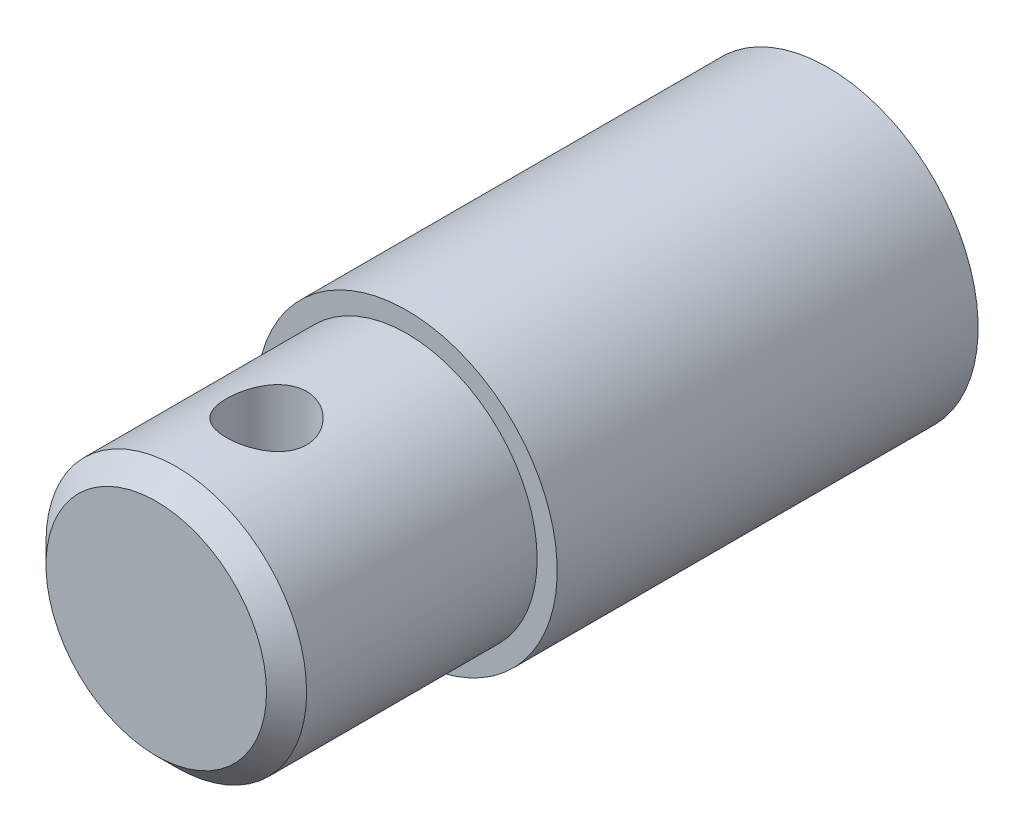
ISO-10303-21;
HEADER;
FILE_DESCRIPTION(('STEP AP214'),'2;1');
FILE_NAME('part.step','',(''),(''),'','','');
FILE_SCHEMA(('AUTOMOTIVE_DESIGN { 1 0 10303 214 1 1 1 1 }'));
ENDSEC;
DATA;
#1=APPLICATION_CONTEXT('core data for automotive mechanical design processes');
#2=APPLICATION_PROTOCOL_DEFINITION('international standard','automotive_design',2000,#1);
#3=PRODUCT_CONTEXT('',#1,'mechanical');
#4=PRODUCT('Part','Part','',(#3));
#5=PRODUCT_RELATED_PRODUCT_CATEGORY('part','',(#4));
#6=PRODUCT_DEFINITION_FORMATION('','',#4);
#7=PRODUCT_DEFINITION_CONTEXT('part definition',#1,'design');
#8=PRODUCT_DEFINITION('design','',#6,#7);
#9=PRODUCT_DEFINITION_SHAPE('','',#8);
#10=(LENGTH_UNIT() NAMED_UNIT(*) SI_UNIT(.MILLI.,.METRE.));
#11=(NAMED_UNIT(*) PLANE_ANGLE_UNIT() SI_UNIT($,.RADIAN.));
#12=(NAMED_UNIT(*) SI_UNIT($,.STERADIAN.) SOLID_ANGLE_UNIT());
#13=UNCERTAINTY_MEASURE_WITH_UNIT(LENGTH_MEASURE(1.E-05),#10,'distance_accuracy_value','');
#14=(GEOMETRIC_REPRESENTATION_CONTEXT(3) GLOBAL_UNCERTAINTY_ASSIGNED_CONTEXT((#13)) GLOBAL_UNIT_ASSIGNED_CONTEXT((#10,
#11,#12)) REPRESENTATION_CONTEXT('',''));
#15=CARTESIAN_POINT('',(0.,0.,0.));
#16=DIRECTION('',(0.,0.,1.));
#17=DIRECTION('',(1.,0.,0.));
#18=AXIS2_PLACEMENT_3D('',#15,#16,#17);
#19=CARTESIAN_POINT('',(0.,0.,42.));
#20=DIRECTION('',(0.,0.,1.));
#21=DIRECTION('',(1.,0.,0.));
#22=AXIS2_PLACEMENT_3D('',#19,#20,#21);
#23=PLANE('',#22);
#24=CARTESIAN_POINT('',(0.,0.,42.));
#25=DIRECTION('',(0.,0.,1.));
#26=DIRECTION('',(1.,0.,0.));
#27=AXIS2_PLACEMENT_3D('',#24,#25,#26);
#28=CIRCLE('',#27,15.);
#29=CARTESIAN_POINT('',(-15.,0.,42.));
#30=VERTEX_POINT('',#29);
#31=EDGE_CURVE('E67',#30,#30,#28,.T.);
#32=ORIENTED_EDGE('',*,*,#31,.T.);
#33=EDGE_LOOP('',(#32));
#34=FACE_BOUND('',#33,.T.);
#35=CARTESIAN_POINT('',(0.,0.,42.));
#36=DIRECTION('',(0.,0.,1.));
#37=DIRECTION('',(1.,0.,0.));
#38=AXIS2_PLACEMENT_3D('',#35,#36,#37);
#39=CIRCLE('',#38,13.);
#40=CARTESIAN_POINT('',(13.,0.,42.));
#41=VERTEX_POINT('',#40);
#42=EDGE_CURVE('E112',#41,#41,#39,.T.);
#43=ORIENTED_EDGE('',*,*,#42,.F.);
#44=EDGE_LOOP('',(#43));
#45=FACE_BOUND('',#44,.T.);
#46=ADVANCED_FACE('F49',(#34,#45),#23,.T.);
#47=CARTESIAN_POINT('',(0.,0.,42.));
#48=DIRECTION('',(0.,0.,-1.));
#49=DIRECTION('',(-1.,0.,0.));
#50=AXIS2_PLACEMENT_3D('',#47,#48,#49);
#51=CYLINDRICAL_SURFACE('',#50,15.);
#52=CARTESIAN_POINT('',(0.,0.,0.));
#53=DIRECTION('',(0.,0.,1.));
#54=DIRECTION('',(1.,0.,0.));
#55=AXIS2_PLACEMENT_3D('',#52,#53,#54);
#56=CIRCLE('',#55,15.);
#57=CARTESIAN_POINT('',(-15.,0.,0.));
#58=VERTEX_POINT('',#57);
#59=EDGE_CURVE('E110',#58,#58,#56,.T.);
#60=CARTESIAN_POINT('',(-15.,0.,42.));
#61=CARTESIAN_POINT('',(-15.,0.,41.5625));
#62=CARTESIAN_POINT('',(-15.,0.,41.125));
#63=CARTESIAN_POINT('',(-15.,0.,40.25));
#64=CARTESIAN_POINT('',(-15.,0.,39.8125));
#65=CARTESIAN_POINT('',(-15.,0.,38.9375));
#66=CARTESIAN_POINT('',(-15.,0.,38.5));
#67=CARTESIAN_POINT('',(-15.,0.,37.625));
#68=CARTESIAN_POINT('',(-15.,0.,37.1875));
#69=CARTESIAN_POINT('',(-15.,0.,36.3125));
#70=CARTESIAN_POINT('',(-15.,0.,35.875));
#71=CARTESIAN_POINT('',(-15.,0.,35.));
#72=CARTESIAN_POINT('',(-15.,0.,34.5625));
#73=CARTESIAN_POINT('',(-15.,0.,33.6875));
#74=CARTESIAN_POINT('',(-15.,0.,33.25));
#75=CARTESIAN_POINT('',(-15.,0.,32.375));
#76=CARTESIAN_POINT('',(-15.,0.,31.9375));
#77=CARTESIAN_POINT('',(-15.,0.,31.0625));
#78=CARTESIAN_POINT('',(-15.,0.,30.625));
#79=CARTESIAN_POINT('',(-15.,0.,29.75));
#80=CARTESIAN_POINT('',(-15.,0.,29.3125));
#81=CARTESIAN_POINT('',(-15.,0.,28.4375));
#82=CARTESIAN_POINT('',(-15.,0.,28.));
#83=CARTESIAN_POINT('',(-15.,0.,27.125));
#84=CARTESIAN_POINT('',(-15.,0.,26.6875));
#85=CARTESIAN_POINT('',(-15.,0.,25.8125));
#86=CARTESIAN_POINT('',(-15.,0.,25.375));
#87=CARTESIAN_POINT('',(-15.,0.,24.5));
#88=CARTESIAN_POINT('',(-15.,0.,24.0625));
#89=CARTESIAN_POINT('',(-15.,0.,23.1875));
#90=CARTESIAN_POINT('',(-15.,0.,22.75));
#91=CARTESIAN_POINT('',(-15.,0.,21.875));
#92=CARTESIAN_POINT('',(-15.,0.,21.4375));
#93=CARTESIAN_POINT('',(-15.,0.,20.5625));
#94=CARTESIAN_POINT('',(-15.,0.,20.125));
#95=CARTESIAN_POINT('',(-15.,0.,19.25));
#96=CARTESIAN_POINT('',(-15.,0.,18.8125));
#97=CARTESIAN_POINT('',(-15.,0.,17.9375));
#98=CARTESIAN_POINT('',(-15.,0.,17.5));
#99=CARTESIAN_POINT('',(-15.,0.,16.625));
#100=CARTESIAN_POINT('',(-15.,0.,16.1875));
#101=CARTESIAN_POINT('',(-15.,0.,15.3125));
#102=CARTESIAN_POINT('',(-15.,0.,14.875));
#103=CARTESIAN_POINT('',(-15.,0.,14.));
#104=CARTESIAN_POINT('',(-15.,0.,13.5625));
#105=CARTESIAN_POINT('',(-15.,0.,12.6875));
#106=CARTESIAN_POINT('',(-15.,0.,12.25));
#107=CARTESIAN_POINT('',(-15.,0.,11.375));
#108=CARTESIAN_POINT('',(-15.,0.,10.9375));
#109=CARTESIAN_POINT('',(-15.,0.,10.0625));
#110=CARTESIAN_POINT('',(-15.,0.,9.625));
#111=CARTESIAN_POINT('',(-15.,0.,8.75));
#112=CARTESIAN_POINT('',(-15.,0.,8.3125));
#113=CARTESIAN_POINT('',(-15.,0.,7.4375));
#114=CARTESIAN_POINT('',(-15.,0.,7.));
#115=CARTESIAN_POINT('',(-15.,0.,6.125));
#116=CARTESIAN_POINT('',(-15.,0.,5.6875));
#117=CARTESIAN_POINT('',(-15.,0.,4.8125));
#118=CARTESIAN_POINT('',(-15.,0.,4.375));
#119=CARTESIAN_POINT('',(-15.,0.,3.5));
#120=CARTESIAN_POINT('',(-15.,0.,3.0625));
#121=CARTESIAN_POINT('',(-15.,0.,2.1875));
#122=CARTESIAN_POINT('',(-15.,0.,1.75));
#123=CARTESIAN_POINT('',(-15.,0.,0.875000000000001));
#124=CARTESIAN_POINT('',(-15.,0.,0.4375));
#125=CARTESIAN_POINT('',(-15.,0.,0.));
#126=B_SPLINE_CURVE_WITH_KNOTS('',3,(#60,#61,#62,#63,#64,#65,#66,#67,#68,#69,#70,#71,#72,#73,
#74,#75,#76,#77,#78,#79,#80,#81,#82,#83,#84,#85,#86,#87,#88,#89,#90,#91,#92,#93,#94,#95,#96,#97,
#98,#99,#100,#101,#102,#103,#104,#105,#106,#107,#108,#109,#110,#111,#112,#113,#114,#115,#116,
#117,#118,#119,#120,#121,#122,#123,#124,#125),.UNSPECIFIED.,.F.,.F.,(4,2,2,2,2,2,2,2,2,2,2,2,2,
2,2,2,2,2,2,2,2,2,2,2,2,2,2,2,2,2,2,2,4),(0.,1.31249999999999,2.625,3.9375,5.25,6.5625,
7.87499999999999,9.18749999999999,10.5,11.8125,13.125,14.4375,15.75,17.0625,18.375,19.6875,21.,
22.3125,23.625,24.9375,26.25,27.5625,28.875,30.1875,31.5,32.8125,34.125,35.4375,36.75,38.0625,
39.375,40.6875,42.),.UNSPECIFIED.);
#127=EDGE_CURVE('BSEAM95',#30,#58,#126,.T.);
#128=ORIENTED_EDGE('',*,*,#31,.F.);
#129=ORIENTED_EDGE('',*,*,#59,.T.);
#130=ORIENTED_EDGE('',*,*,#127,.T.);
#131=ORIENTED_EDGE('',*,*,#127,.F.);
#132=EDGE_LOOP('',(#128,#130,#129,#131));
#133=FACE_BOUND('',#132,.T.);
#134=ADVANCED_FACE('F95',(#133),#51,.T.);
#135=CARTESIAN_POINT('',(0.,0.,0.));
#136=DIRECTION('',(0.,0.,1.));
#137=DIRECTION('',(1.,0.,0.));
#138=AXIS2_PLACEMENT_3D('',#135,#136,#137);
#139=PLANE('',#138);
#140=ORIENTED_EDGE('',*,*,#59,.F.);
#141=EDGE_LOOP('',(#140));
#142=FACE_BOUND('',#141,.T.);
#143=ADVANCED_FACE('F93',(#142),#139,.F.);
#144=CARTESIAN_POINT('',(0.,0.,67.));
#145=DIRECTION('',(0.,0.,-1.));
#146=DIRECTION('',(-1.,0.,0.));
#147=AXIS2_PLACEMENT_3D('',#144,#145,#146);
#148=CYLINDRICAL_SURFACE('',#147,13.);
#149=CARTESIAN_POINT('',(0.,-13.,60.));
#150=CARTESIAN_POINT('',(0.21917294310816,-12.9999985837487,59.9999980781581));
#151=CARTESIAN_POINT('',(0.43836552269895,-12.9944047158586,59.9819267047935));
#152=CARTESIAN_POINT('',(0.870351057968746,-12.9726371053014,59.9103011761296));
#153=CARTESIAN_POINT('',(1.08314237260056,-12.9564606734307,59.856738001735));
#154=CARTESIAN_POINT('',(1.4960330939694,-12.9152971697535,59.7160985862144));
#155=CARTESIAN_POINT('',(1.69615125418069,-12.8903234932247,59.6290732784464));
#156=CARTESIAN_POINT('',(2.07895491073435,-12.8341507183588,59.4241935852655));
#157=CARTESIAN_POINT('',(2.26163781838711,-12.8029506976878,59.3063346315324));
#158=CARTESIAN_POINT('',(2.60987398495358,-12.7365950481322,59.0394046491201));
#159=CARTESIAN_POINT('',(2.77482977131675,-12.7013552117493,58.8895751615137));
#160=CARTESIAN_POINT('',(3.07771416539747,-12.6313850563073,58.5645727529841));
#161=CARTESIAN_POINT('',(3.21563793325195,-12.5966548295175,58.3893953034562));
#162=CARTESIAN_POINT('',(3.46374552369846,-12.5307375569115,58.0135427911452));
#163=CARTESIAN_POINT('',(3.57318962723976,-12.4996547208754,57.8123594214041));
#164=CARTESIAN_POINT('',(3.75644488363178,-12.4458149677457,57.3933320725259));
#165=CARTESIAN_POINT('',(3.83026509829399,-12.4230559336455,57.1754923466926));
#166=CARTESIAN_POINT('',(3.9380032102631,-12.3893201800033,56.7360653878938));
#167=CARTESIAN_POINT('',(3.97302679111731,-12.3780178006712,56.5147749327805));
#168=CARTESIAN_POINT('',(4.00563111791087,-12.3675074101,56.0691925188601));
#169=CARTESIAN_POINT('',(4.00322147146571,-12.3682962955151,55.8449013449835));
#170=CARTESIAN_POINT('',(3.96189396455673,-12.3815913869604,55.4087698587764));
#171=CARTESIAN_POINT('',(3.92437369402148,-12.3936490135325,55.1967811492745));
#172=CARTESIAN_POINT('',(3.81615290498389,-12.4273954440124,54.7822666067291));
#173=CARTESIAN_POINT('',(3.74544895828906,-12.4490852430036,54.5797417537704));
#174=CARTESIAN_POINT('',(3.57186443402681,-12.5000014147365,54.1865399043348));
#175=CARTESIAN_POINT('',(3.46853941654593,-12.5293308435506,53.9960730287498));
#176=CARTESIAN_POINT('',(3.23295451696218,-12.5921734714446,53.6347189112499));
#177=CARTESIAN_POINT('',(3.10068731271405,-12.62568772833,53.4638366407863));
#178=CARTESIAN_POINT('',(2.80408228262993,-12.6949310396933,53.1385912233378));
#179=CARTESIAN_POINT('',(2.63858832591729,-12.7306926222691,52.9852874348672));
#180=CARTESIAN_POINT('',(2.28379541764923,-12.7990966106587,52.7083555913132));
#181=CARTESIAN_POINT('',(2.09449480981525,-12.8317387991714,52.5847296027189));
#182=CARTESIAN_POINT('',(1.69546584739518,-12.8905511373571,52.3699740457451));
#183=CARTESIAN_POINT('',(1.48559743793384,-12.9166718999808,52.2790902719224));
#184=CARTESIAN_POINT('',(1.05256186981955,-12.959142046389,52.1342274920829));
#185=CARTESIAN_POINT('',(0.829398642031535,-12.9754943028036,52.0802376359787));
#186=CARTESIAN_POINT('',(0.385105664864496,-12.996125801437,52.0124839068498));
#187=CARTESIAN_POINT('',(0.164214373456254,-13.0008354422861,51.9972852948686));
#188=CARTESIAN_POINT('',(-0.276982356015462,-12.9989200063321,52.003509532976));
#189=CARTESIAN_POINT('',(-0.497287872376593,-12.9922965294463,52.0249272138741));
#190=CARTESIAN_POINT('',(-0.925571602902956,-12.9687414969643,52.1026209642205));
#191=CARTESIAN_POINT('',(-1.13371871756011,-12.9520607954816,52.1580492943323));
#192=CARTESIAN_POINT('',(-1.53770562273872,-12.9103345307273,52.3011621528542));
#193=CARTESIAN_POINT('',(-1.73354390450734,-12.8852879443756,52.3888506265522));
#194=CARTESIAN_POINT('',(-2.11255922889336,-12.8286676582193,52.5963423896199));
#195=CARTESIAN_POINT('',(-2.29532163039124,-12.7969522254664,52.7168633535303));
#196=CARTESIAN_POINT('',(-2.63851213664825,-12.7306266724605,52.9857336601617));
#197=CARTESIAN_POINT('',(-2.79893434148183,-12.6960157913837,53.1340903299521));
#198=CARTESIAN_POINT('',(-3.09927056018192,-12.6261329181932,53.4611665988979));
#199=CARTESIAN_POINT('',(-3.23816262016191,-12.5908864468145,53.6408321518986));
#200=CARTESIAN_POINT('',(-3.48390975546085,-12.5251192663438,54.0216866692037));
#201=CARTESIAN_POINT('',(-3.59076547791575,-12.4945984617991,54.2228751986315));
#202=CARTESIAN_POINT('',(-3.76871415530627,-12.4420825365784,54.6405565138581));
#203=CARTESIAN_POINT('',(-3.83995734204779,-12.4200516926804,54.8569805395461));
#204=CARTESIAN_POINT('',(-3.9447505224365,-12.3871715179266,55.2995652314521));
#205=CARTESIAN_POINT('',(-3.97831429744217,-12.376318099014,55.525722306332));
#206=CARTESIAN_POINT('',(-4.00582647580866,-12.3674386474697,55.9706961442159));
#207=CARTESIAN_POINT('',(-4.00144721441457,-12.3688710878687,56.1894000091021));
#208=CARTESIAN_POINT('',(-3.95721713123478,-12.383091699643,56.6227956776945));
#209=CARTESIAN_POINT('',(-3.9173678708517,-12.3958793711567,56.8374876575806));
#210=CARTESIAN_POINT('',(-3.80443315735091,-12.4309970121687,57.253874857075));
#211=CARTESIAN_POINT('',(-3.73181232996621,-12.4531933302876,57.4557082113697));
#212=CARTESIAN_POINT('',(-3.55576002495547,-12.5045968200808,57.844487113251));
#213=CARTESIAN_POINT('',(-3.45232242013249,-12.5338053857525,58.0314296907775));
#214=CARTESIAN_POINT('',(-3.21296345751964,-12.5973303286733,58.392825014961));
#215=CARTESIAN_POINT('',(-3.07595504034661,-12.6317988648256,58.5665309882651));
#216=CARTESIAN_POINT('',(-2.7752734351575,-12.7012452733731,58.889028133959));
#217=CARTESIAN_POINT('',(-2.61159320000447,-12.7362232781481,59.0378127005731));
#218=CARTESIAN_POINT('',(-2.25604634155051,-12.8040608482866,59.3108983591937));
#219=CARTESIAN_POINT('',(-2.06345773137061,-12.8368198127607,59.4342871506697));
#220=CARTESIAN_POINT('',(-1.6592623840196,-12.8952876611706,59.646768913305));
#221=CARTESIAN_POINT('',(-1.44766372806481,-12.9209995221938,59.7358763732421));
#222=CARTESIAN_POINT('',(-1.03185930514284,-12.9605069669283,59.8702014241204));
#223=CARTESIAN_POINT('',(-0.828806517031058,-12.975190696109,59.9187389421783));
#224=CARTESIAN_POINT('',(-0.417174383657038,-12.9949369818214,59.9836361186465));
#225=CARTESIAN_POINT('',(-0.208596085316671,-13.0000013479058,60.0000018290976));
#226=CARTESIAN_POINT('',(0.,-13.,60.));
#227=B_SPLINE_CURVE_WITH_KNOTS('',3,(#149,#150,#151,#152,#153,#154,#155,#156,#157,#158,#159,
#160,#161,#162,#163,#164,#165,#166,#167,#168,#169,#170,#171,#172,#173,#174,#175,#176,#177,#178,
#179,#180,#181,#182,#183,#184,#185,#186,#187,#188,#189,#190,#191,#192,#193,#194,#195,#196,#197,
#198,#199,#200,#201,#202,#203,#204,#205,#206,#207,#208,#209,#210,#211,#212,#213,#214,#215,#216,
#217,#218,#219,#220,#221,#222,#223,#224,#225,#226),.UNSPECIFIED.,.T.,.F.,(4,2,2,2,2,2,2,2,2,2,2,
2,2,2,2,2,2,2,2,2,2,2,2,2,2,2,2,2,2,2,2,2,2,2,2,2,2,2,4),(0.,0.656752296706408,1.31367154984093,
1.96959482663929,2.62561534027589,3.29939203924104,3.97328926246384,4.6632523995077,
5.35303993483895,6.0226182549244,6.69202472381785,7.3358697190642,7.97978124432902,
8.6328744918095,9.28613315816514,9.96817015993202,10.6502546387186,11.337357751299,
12.0242587074941,12.6853593330308,13.3463666374628,13.9915318440469,14.6367759780257,
15.2974465070423,15.9582911860325,16.6444697560881,17.3306344643609,18.0138796233906,
18.6968748019418,19.3499255144245,20.0029474807923,20.6469886056139,21.2911578685366,
21.9598589697368,22.6287370402031,23.318555051744,24.0080811951411,24.6332575269448,
25.2583162416424),.UNSPECIFIED.);
#228=CARTESIAN_POINT('',(0.,-13.,60.));
#229=VERTEX_POINT('',#228);
#230=EDGE_CURVE('E53',#229,#229,#227,.T.);
#231=ORIENTED_EDGE('',*,*,#230,.T.);
#232=EDGE_LOOP('',(#231));
#233=FACE_BOUND('',#232,.T.);
#234=CARTESIAN_POINT('',(0.,13.,60.));
#235=CARTESIAN_POINT('',(-0.21917294310816,12.9999985837487,59.9999980781581));
#236=CARTESIAN_POINT('',(-0.43836552269895,12.9944047158586,59.9819267047935));
#237=CARTESIAN_POINT('',(-0.870351057968746,12.9726371053014,59.9103011761296));
#238=CARTESIAN_POINT('',(-1.08314237260056,12.9564606734307,59.856738001735));
#239=CARTESIAN_POINT('',(-1.4960330939694,12.9152971697535,59.7160985862144));
#240=CARTESIAN_POINT('',(-1.69615125418069,12.8903234932247,59.6290732784464));
#241=CARTESIAN_POINT('',(-2.07895491073435,12.8341507183588,59.4241935852655));
#242=CARTESIAN_POINT('',(-2.26163781838711,12.8029506976878,59.3063346315324));
#243=CARTESIAN_POINT('',(-2.60987398495358,12.7365950481322,59.0394046491201));
#244=CARTESIAN_POINT('',(-2.77482977131675,12.7013552117493,58.8895751615137));
#245=CARTESIAN_POINT('',(-3.07771416539747,12.6313850563073,58.5645727529841));
#246=CARTESIAN_POINT('',(-3.21563793325195,12.5966548295175,58.3893953034562));
#247=CARTESIAN_POINT('',(-3.46374552369846,12.5307375569115,58.0135427911452));
#248=CARTESIAN_POINT('',(-3.57318962723976,12.4996547208754,57.8123594214041));
#249=CARTESIAN_POINT('',(-3.75644488363178,12.4458149677457,57.3933320725259));
#250=CARTESIAN_POINT('',(-3.83026509829399,12.4230559336455,57.1754923466926));
#251=CARTESIAN_POINT('',(-3.9380032102631,12.3893201800033,56.7360653878938));
#252=CARTESIAN_POINT('',(-3.97302679111731,12.3780178006712,56.5147749327805));
#253=CARTESIAN_POINT('',(-4.00563111791087,12.3675074101,56.0691925188601));
#254=CARTESIAN_POINT('',(-4.00322147146571,12.3682962955151,55.8449013449835));
#255=CARTESIAN_POINT('',(-3.96189396455673,12.3815913869604,55.4087698587764));
#256=CARTESIAN_POINT('',(-3.92437369402148,12.3936490135325,55.1967811492745));
#257=CARTESIAN_POINT('',(-3.81615290498389,12.4273954440124,54.7822666067291));
#258=CARTESIAN_POINT('',(-3.74544895828906,12.4490852430036,54.5797417537704));
#259=CARTESIAN_POINT('',(-3.57186443402681,12.5000014147365,54.1865399043348));
#260=CARTESIAN_POINT('',(-3.46853941654593,12.5293308435506,53.9960730287498));
#261=CARTESIAN_POINT('',(-3.23295451696218,12.5921734714446,53.6347189112499));
#262=CARTESIAN_POINT('',(-3.10068731271405,12.62568772833,53.4638366407863));
#263=CARTESIAN_POINT('',(-2.80408228262993,12.6949310396933,53.1385912233378));
#264=CARTESIAN_POINT('',(-2.63858832591729,12.7306926222691,52.9852874348672));
#265=CARTESIAN_POINT('',(-2.28379541764923,12.7990966106587,52.7083555913132));
#266=CARTESIAN_POINT('',(-2.09449480981525,12.8317387991714,52.5847296027189));
#267=CARTESIAN_POINT('',(-1.69546584739518,12.8905511373571,52.3699740457451));
#268=CARTESIAN_POINT('',(-1.48559743793384,12.9166718999808,52.2790902719224));
#269=CARTESIAN_POINT('',(-1.05256186981955,12.959142046389,52.1342274920829));
#270=CARTESIAN_POINT('',(-0.829398642031535,12.9754943028036,52.0802376359787));
#271=CARTESIAN_POINT('',(-0.385105664864496,12.996125801437,52.0124839068498));
#272=CARTESIAN_POINT('',(-0.164214373456254,13.0008354422861,51.9972852948686));
#273=CARTESIAN_POINT('',(0.276982356015462,12.9989200063321,52.003509532976));
#274=CARTESIAN_POINT('',(0.497287872376593,12.9922965294463,52.0249272138741));
#275=CARTESIAN_POINT('',(0.925571602902956,12.9687414969643,52.1026209642205));
#276=CARTESIAN_POINT('',(1.13371871756011,12.9520607954816,52.1580492943323));
#277=CARTESIAN_POINT('',(1.53770562273872,12.9103345307273,52.3011621528542));
#278=CARTESIAN_POINT('',(1.73354390450734,12.8852879443756,52.3888506265522));
#279=CARTESIAN_POINT('',(2.11255922889336,12.8286676582193,52.5963423896199));
#280=CARTESIAN_POINT('',(2.29532163039124,12.7969522254664,52.7168633535303));
#281=CARTESIAN_POINT('',(2.63851213664825,12.7306266724605,52.9857336601617));
#282=CARTESIAN_POINT('',(2.79893434148183,12.6960157913837,53.1340903299521));
#283=CARTESIAN_POINT('',(3.09927056018192,12.6261329181932,53.4611665988979));
#284=CARTESIAN_POINT('',(3.23816262016191,12.5908864468145,53.6408321518986));
#285=CARTESIAN_POINT('',(3.48390975546085,12.5251192663438,54.0216866692037));
#286=CARTESIAN_POINT('',(3.59076547791575,12.4945984617991,54.2228751986315));
#287=CARTESIAN_POINT('',(3.76871415530627,12.4420825365784,54.6405565138581));
#288=CARTESIAN_POINT('',(3.83995734204779,12.4200516926804,54.8569805395461));
#289=CARTESIAN_POINT('',(3.9447505224365,12.3871715179266,55.2995652314521));
#290=CARTESIAN_POINT('',(3.97831429744217,12.376318099014,55.525722306332));
#291=CARTESIAN_POINT('',(4.00582647580866,12.3674386474697,55.9706961442159));
#292=CARTESIAN_POINT('',(4.00144721441457,12.3688710878687,56.1894000091021));
#293=CARTESIAN_POINT('',(3.95721713123478,12.383091699643,56.6227956776945));
#294=CARTESIAN_POINT('',(3.9173678708517,12.3958793711567,56.8374876575806));
#295=CARTESIAN_POINT('',(3.80443315735091,12.4309970121687,57.253874857075));
#296=CARTESIAN_POINT('',(3.73181232996621,12.4531933302876,57.4557082113697));
#297=CARTESIAN_POINT('',(3.55576002495547,12.5045968200808,57.844487113251));
#298=CARTESIAN_POINT('',(3.45232242013249,12.5338053857525,58.0314296907775));
#299=CARTESIAN_POINT('',(3.21296345751964,12.5973303286733,58.392825014961));
#300=CARTESIAN_POINT('',(3.07595504034661,12.6317988648256,58.5665309882651));
#301=CARTESIAN_POINT('',(2.7752734351575,12.7012452733731,58.889028133959));
#302=CARTESIAN_POINT('',(2.61159320000447,12.7362232781481,59.0378127005731));
#303=CARTESIAN_POINT('',(2.25604634155051,12.8040608482866,59.3108983591937));
#304=CARTESIAN_POINT('',(2.06345773137061,12.8368198127607,59.4342871506697));
#305=CARTESIAN_POINT('',(1.6592623840196,12.8952876611706,59.646768913305));
#306=CARTESIAN_POINT('',(1.44766372806481,12.9209995221938,59.7358763732421));
#307=CARTESIAN_POINT('',(1.03185930514284,12.9605069669283,59.8702014241204));
#308=CARTESIAN_POINT('',(0.828806517031058,12.975190696109,59.9187389421783));
#309=CARTESIAN_POINT('',(0.417174383657038,12.9949369818214,59.9836361186465));
#310=CARTESIAN_POINT('',(0.208596085316671,13.0000013479058,60.0000018290976));
#311=CARTESIAN_POINT('',(0.,13.,60.));
#312=B_SPLINE_CURVE_WITH_KNOTS('',3,(#234,#235,#236,#237,#238,#239,#240,#241,#242,#243,#244,
#245,#246,#247,#248,#249,#250,#251,#252,#253,#254,#255,#256,#257,#258,#259,#260,#261,#262,#263,
#264,#265,#266,#267,#268,#269,#270,#271,#272,#273,#274,#275,#276,#277,#278,#279,#280,#281,#282,
#283,#284,#285,#286,#287,#288,#289,#290,#291,#292,#293,#294,#295,#296,#297,#298,#299,#300,#301,
#302,#303,#304,#305,#306,#307,#308,#309,#310,#311),.UNSPECIFIED.,.T.,.F.,(4,2,2,2,2,2,2,2,2,2,2,
2,2,2,2,2,2,2,2,2,2,2,2,2,2,2,2,2,2,2,2,2,2,2,2,2,2,2,4),(0.,0.656752296706408,1.31367154984093,
1.96959482663929,2.62561534027589,3.29939203924104,3.97328926246384,4.6632523995077,
5.35303993483895,6.0226182549244,6.69202472381785,7.3358697190642,7.97978124432902,
8.6328744918095,9.28613315816514,9.96817015993202,10.6502546387186,11.337357751299,
12.0242587074941,12.6853593330308,13.3463666374628,13.9915318440469,14.6367759780257,
15.2974465070423,15.9582911860325,16.6444697560881,17.3306344643609,18.0138796233906,
18.6968748019418,19.3499255144245,20.0029474807923,20.6469886056139,21.2911578685366,
21.9598589697368,22.6287370402031,23.318555051744,24.0080811951411,24.6332575269448,
25.2583162416424),.UNSPECIFIED.);
#313=CARTESIAN_POINT('',(0.,13.,60.));
#314=VERTEX_POINT('',#313);
#315=EDGE_CURVE('E70',#314,#314,#312,.T.);
#316=ORIENTED_EDGE('',*,*,#315,.T.);
#317=EDGE_LOOP('',(#316));
#318=FACE_BOUND('',#317,.T.);
#319=CARTESIAN_POINT('',(0.,0.,65.));
#320=DIRECTION('',(0.,0.,1.));
#321=DIRECTION('',(1.,0.,0.));
#322=AXIS2_PLACEMENT_3D('',#319,#320,#321);
#323=CIRCLE('',#322,13.);
#324=CARTESIAN_POINT('',(13.,0.,65.));
#325=VERTEX_POINT('',#324);
#326=EDGE_CURVE('E12',#325,#325,#323,.F.);
#327=ORIENTED_EDGE('',*,*,#326,.T.);
#328=EDGE_LOOP('',(#327));
#329=FACE_BOUND('',#328,.T.);
#330=ORIENTED_EDGE('',*,*,#42,.T.);
#331=EDGE_LOOP('',(#330));
#332=FACE_BOUND('',#331,.T.);
#333=ADVANCED_FACE('F75',(#233,#318,#329,#332),#148,.T.);
#334=CARTESIAN_POINT('',(0.,0.,67.));
#335=DIRECTION('',(0.,0.,1.));
#336=DIRECTION('',(1.,0.,0.));
#337=AXIS2_PLACEMENT_3D('',#334,#335,#336);
#338=PLANE('',#337);
#339=CARTESIAN_POINT('',(0.,0.,67.));
#340=DIRECTION('',(0.,0.,1.));
#341=DIRECTION('',(1.,0.,0.));
#342=AXIS2_PLACEMENT_3D('',#339,#340,#341);
#343=CIRCLE('',#342,11.);
#344=CARTESIAN_POINT('',(11.,0.,67.));
#345=VERTEX_POINT('',#344);
#346=EDGE_CURVE('E62',#345,#345,#343,.T.);
#347=ORIENTED_EDGE('',*,*,#346,.T.);
#348=EDGE_LOOP('',(#347));
#349=FACE_BOUND('',#348,.T.);
#350=ADVANCED_FACE('F83',(#349),#338,.T.);
#351=CARTESIAN_POINT('',(0.,0.,67.));
#352=DIRECTION('',(0.,0.,-1.));
#353=DIRECTION('',(-1.,0.,0.));
#354=AXIS2_PLACEMENT_3D('',#351,#352,#353);
#355=CONICAL_SURFACE('',#354,11.,0.785398163397453);
#356=ORIENTED_EDGE('',*,*,#326,.F.);
#357=EDGE_LOOP('',(#356));
#358=FACE_BOUND('',#357,.T.);
#359=ORIENTED_EDGE('',*,*,#346,.F.);
#360=EDGE_LOOP('',(#359));
#361=FACE_BOUND('',#360,.T.);
#362=ADVANCED_FACE('F51',(#358,#361),#355,.T.);
#363=CARTESIAN_POINT('',(0.,-15.,56.));
#364=DIRECTION('',(0.,1.,0.));
#365=DIRECTION('',(0.,0.,1.));
#366=AXIS2_PLACEMENT_3D('',#363,#364,#365);
#367=CYLINDRICAL_SURFACE('',#366,4.00000000000001);
#368=ORIENTED_EDGE('',*,*,#315,.F.);
#369=EDGE_LOOP('',(#368));
#370=FACE_BOUND('',#369,.T.);
#371=ORIENTED_EDGE('',*,*,#230,.F.);
#372=EDGE_LOOP('',(#371));
#373=FACE_BOUND('',#372,.T.);
#374=ADVANCED_FACE('F79',(#370,#373),#367,.F.);
#375=CLOSED_SHELL('',(#46,#134,#143,#333,#350,#362,#374));
#376=MANIFOLD_SOLID_BREP('B2',#375);
#377=ADVANCED_BREP_SHAPE_REPRESENTATION('',(#18,#376),#14);
#378=SHAPE_DEFINITION_REPRESENTATION(#9,#377);
ENDSEC;
END-ISO-10303-21;
